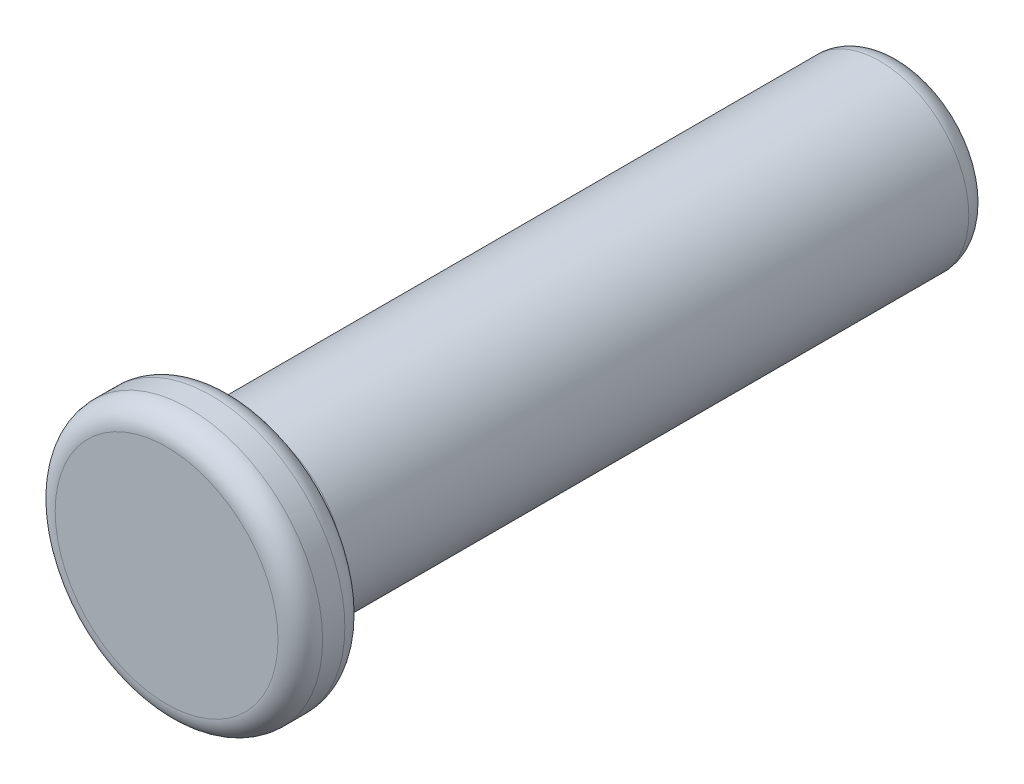
ISO-10303-21;
HEADER;
FILE_DESCRIPTION(('STEP AP214'),'2;1');
FILE_NAME('part.step','',(''),(''),'','','');
FILE_SCHEMA(('AUTOMOTIVE_DESIGN { 1 0 10303 214 1 1 1 1 }'));
ENDSEC;
DATA;
#1=APPLICATION_CONTEXT('core data for automotive mechanical design processes');
#2=APPLICATION_PROTOCOL_DEFINITION('international standard','automotive_design',2000,#1);
#3=PRODUCT_CONTEXT('',#1,'mechanical');
#4=PRODUCT('Part','Part','',(#3));
#5=PRODUCT_RELATED_PRODUCT_CATEGORY('part','',(#4));
#6=PRODUCT_DEFINITION_FORMATION('','',#4);
#7=PRODUCT_DEFINITION_CONTEXT('part definition',#1,'design');
#8=PRODUCT_DEFINITION('design','',#6,#7);
#9=PRODUCT_DEFINITION_SHAPE('','',#8);
#10=(LENGTH_UNIT() NAMED_UNIT(*) SI_UNIT(.MILLI.,.METRE.));
#11=(NAMED_UNIT(*) PLANE_ANGLE_UNIT() SI_UNIT($,.RADIAN.));
#12=(NAMED_UNIT(*) SI_UNIT($,.STERADIAN.) SOLID_ANGLE_UNIT());
#13=UNCERTAINTY_MEASURE_WITH_UNIT(LENGTH_MEASURE(1.E-05),#10,'distance_accuracy_value','');
#14=(GEOMETRIC_REPRESENTATION_CONTEXT(3) GLOBAL_UNCERTAINTY_ASSIGNED_CONTEXT((#13)) GLOBAL_UNIT_ASSIGNED_CONTEXT((#10,
#11,#12)) REPRESENTATION_CONTEXT('',''));
#15=CARTESIAN_POINT('',(0.,0.,0.));
#16=DIRECTION('',(0.,0.,1.));
#17=DIRECTION('',(1.,0.,0.));
#18=AXIS2_PLACEMENT_3D('',#15,#16,#17);
#19=CARTESIAN_POINT('',(0.,0.,15.));
#20=DIRECTION('',(0.,0.,-1.));
#21=DIRECTION('',(-1.,0.,0.));
#22=AXIS2_PLACEMENT_3D('',#19,#20,#21);
#23=CYLINDRICAL_SURFACE('',#22,4.);
#24=CARTESIAN_POINT('',(0.,0.,14.));
#25=DIRECTION('',(0.,0.,1.));
#26=DIRECTION('',(1.,0.,0.));
#27=AXIS2_PLACEMENT_3D('',#24,#25,#26);
#28=CIRCLE('',#27,4.);
#29=CARTESIAN_POINT('',(4.,0.,14.));
#30=VERTEX_POINT('',#29);
#31=EDGE_CURVE('E41',#30,#30,#28,.F.);
#32=ORIENTED_EDGE('',*,*,#31,.T.);
#33=EDGE_LOOP('',(#32));
#34=FACE_BOUND('',#33,.T.);
#35=CARTESIAN_POINT('',(0.,0.,-14.));
#36=DIRECTION('',(0.,0.,1.));
#37=DIRECTION('',(1.,0.,0.));
#38=AXIS2_PLACEMENT_3D('',#35,#36,#37);
#39=CIRCLE('',#38,4.);
#40=CARTESIAN_POINT('',(4.,0.,-14.));
#41=VERTEX_POINT('',#40);
#42=EDGE_CURVE('E45',#41,#41,#39,.T.);
#43=ORIENTED_EDGE('',*,*,#42,.T.);
#44=EDGE_LOOP('',(#43));
#45=FACE_BOUND('',#44,.T.);
#46=ADVANCED_FACE('F33',(#34,#45),#23,.T.);
#47=CARTESIAN_POINT('',(0.,0.,-15.));
#48=DIRECTION('',(0.,0.,1.));
#49=DIRECTION('',(1.,0.,0.));
#50=AXIS2_PLACEMENT_3D('',#47,#48,#49);
#51=PLANE('',#50);
#52=CARTESIAN_POINT('',(0.,0.,-15.));
#53=DIRECTION('',(0.,0.,1.));
#54=DIRECTION('',(1.,0.,0.));
#55=AXIS2_PLACEMENT_3D('',#52,#53,#54);
#56=CIRCLE('',#55,3.);
#57=CARTESIAN_POINT('',(3.,0.,-15.));
#58=VERTEX_POINT('',#57);
#59=EDGE_CURVE('E10',#58,#58,#56,.F.);
#60=ORIENTED_EDGE('',*,*,#59,.T.);
#61=EDGE_LOOP('',(#60));
#62=FACE_BOUND('',#61,.T.);
#63=ADVANCED_FACE('F80',(#62),#51,.F.);
#64=CARTESIAN_POINT('',(0.,0.,18.));
#65=DIRECTION('',(0.,0.,-1.));
#66=DIRECTION('',(-1.,0.,0.));
#67=AXIS2_PLACEMENT_3D('',#64,#65,#66);
#68=CYLINDRICAL_SURFACE('',#67,6.);
#69=CARTESIAN_POINT('',(0.,0.,17.));
#70=DIRECTION('',(0.,0.,1.));
#71=DIRECTION('',(1.,0.,0.));
#72=AXIS2_PLACEMENT_3D('',#69,#70,#71);
#73=CIRCLE('',#72,6.);
#74=CARTESIAN_POINT('',(6.,0.,17.));
#75=VERTEX_POINT('',#74);
#76=EDGE_CURVE('E50',#75,#75,#73,.F.);
#77=ORIENTED_EDGE('',*,*,#76,.T.);
#78=EDGE_LOOP('',(#77));
#79=FACE_BOUND('',#78,.T.);
#80=CARTESIAN_POINT('',(0.,0.,16.));
#81=DIRECTION('',(0.,0.,1.));
#82=DIRECTION('',(1.,0.,0.));
#83=AXIS2_PLACEMENT_3D('',#80,#81,#82);
#84=CIRCLE('',#83,6.);
#85=CARTESIAN_POINT('',(6.,0.,16.));
#86=VERTEX_POINT('',#85);
#87=EDGE_CURVE('E53',#86,#86,#84,.T.);
#88=ORIENTED_EDGE('',*,*,#87,.T.);
#89=EDGE_LOOP('',(#88));
#90=FACE_BOUND('',#89,.T.);
#91=ADVANCED_FACE('F86',(#79,#90),#68,.T.);
#92=CARTESIAN_POINT('',(0.,0.,18.));
#93=DIRECTION('',(0.,0.,1.));
#94=DIRECTION('',(1.,0.,0.));
#95=AXIS2_PLACEMENT_3D('',#92,#93,#94);
#96=PLANE('',#95);
#97=CARTESIAN_POINT('',(0.,0.,18.));
#98=DIRECTION('',(0.,0.,1.));
#99=DIRECTION('',(1.,0.,0.));
#100=AXIS2_PLACEMENT_3D('',#97,#98,#99);
#101=CIRCLE('',#100,5.);
#102=CARTESIAN_POINT('',(5.,0.,18.));
#103=VERTEX_POINT('',#102);
#104=EDGE_CURVE('E56',#103,#103,#101,.T.);
#105=ORIENTED_EDGE('',*,*,#104,.T.);
#106=EDGE_LOOP('',(#105));
#107=FACE_BOUND('',#106,.T.);
#108=ADVANCED_FACE('F75',(#107),#96,.T.);
#109=CARTESIAN_POINT('',(0.,0.,17.));
#110=DIRECTION('',(0.,0.,1.));
#111=DIRECTION('',(1.,0.,0.));
#112=AXIS2_PLACEMENT_3D('',#109,#110,#111);
#113=TOROIDAL_SURFACE('',#112,5.,1.);
#114=ORIENTED_EDGE('',*,*,#76,.F.);
#115=EDGE_LOOP('',(#114));
#116=FACE_BOUND('',#115,.T.);
#117=ORIENTED_EDGE('',*,*,#104,.F.);
#118=EDGE_LOOP('',(#117));
#119=FACE_BOUND('',#118,.T.);
#120=ADVANCED_FACE('F68',(#116,#119),#113,.T.);
#121=CARTESIAN_POINT('',(0.,0.,14.));
#122=DIRECTION('',(0.,0.,1.));
#123=DIRECTION('',(1.,0.,0.));
#124=AXIS2_PLACEMENT_3D('',#121,#122,#123);
#125=TOROIDAL_SURFACE('',#124,5.,1.);
#126=ORIENTED_EDGE('',*,*,#31,.F.);
#127=EDGE_LOOP('',(#126));
#128=FACE_BOUND('',#127,.T.);
#129=CARTESIAN_POINT('',(0.,0.,15.));
#130=DIRECTION('',(0.,0.,1.));
#131=DIRECTION('',(1.,0.,0.));
#132=AXIS2_PLACEMENT_3D('',#129,#130,#131);
#133=CIRCLE('',#132,5.);
#134=CARTESIAN_POINT('',(5.,0.,15.));
#135=VERTEX_POINT('',#134);
#136=EDGE_CURVE('E37',#135,#135,#133,.T.);
#137=ORIENTED_EDGE('',*,*,#136,.F.);
#138=EDGE_LOOP('',(#137));
#139=FACE_BOUND('',#138,.T.);
#140=ADVANCED_FACE('F66',(#128,#139),#125,.F.);
#141=CARTESIAN_POINT('',(0.,0.,16.));
#142=DIRECTION('',(0.,0.,1.));
#143=DIRECTION('',(1.,0.,0.));
#144=AXIS2_PLACEMENT_3D('',#141,#142,#143);
#145=TOROIDAL_SURFACE('',#144,5.,1.);
#146=ORIENTED_EDGE('',*,*,#136,.T.);
#147=EDGE_LOOP('',(#146));
#148=FACE_BOUND('',#147,.T.);
#149=ORIENTED_EDGE('',*,*,#87,.F.);
#150=EDGE_LOOP('',(#149));
#151=FACE_BOUND('',#150,.T.);
#152=ADVANCED_FACE('F63',(#148,#151),#145,.T.);
#153=CARTESIAN_POINT('',(0.,0.,-14.));
#154=DIRECTION('',(0.,0.,1.));
#155=DIRECTION('',(1.,0.,0.));
#156=AXIS2_PLACEMENT_3D('',#153,#154,#155);
#157=TOROIDAL_SURFACE('',#156,3.,1.);
#158=ORIENTED_EDGE('',*,*,#59,.F.);
#159=EDGE_LOOP('',(#158));
#160=FACE_BOUND('',#159,.T.);
#161=ORIENTED_EDGE('',*,*,#42,.F.);
#162=EDGE_LOOP('',(#161));
#163=FACE_BOUND('',#162,.T.);
#164=ADVANCED_FACE('F35',(#160,#163),#157,.T.);
#165=CLOSED_SHELL('',(#46,#63,#91,#108,#120,#140,#152,#164));
#166=MANIFOLD_SOLID_BREP('B2',#165);
#167=ADVANCED_BREP_SHAPE_REPRESENTATION('',(#18,#166),#14);
#168=SHAPE_DEFINITION_REPRESENTATION(#9,#167);
ENDSEC;
END-ISO-10303-21;
